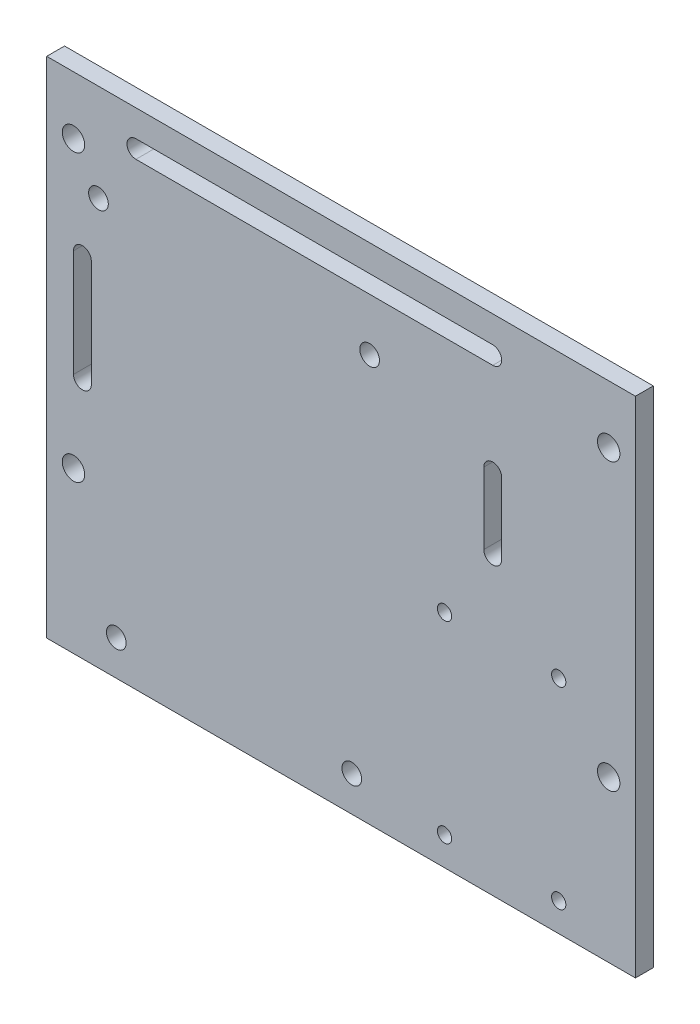
ISO-10303-21;
HEADER;
FILE_DESCRIPTION(('STEP AP214'),'2;1');
FILE_NAME('part.step','',(''),(''),'','','');
FILE_SCHEMA(('AUTOMOTIVE_DESIGN { 1 0 10303 214 1 1 1 1 }'));
ENDSEC;
DATA;
#1=APPLICATION_CONTEXT('core data for automotive mechanical design processes');
#2=APPLICATION_PROTOCOL_DEFINITION('international standard','automotive_design',2000,#1);
#3=PRODUCT_CONTEXT('',#1,'mechanical');
#4=PRODUCT('Part','Part','',(#3));
#5=PRODUCT_RELATED_PRODUCT_CATEGORY('part','',(#4));
#6=PRODUCT_DEFINITION_FORMATION('','',#4);
#7=PRODUCT_DEFINITION_CONTEXT('part definition',#1,'design');
#8=PRODUCT_DEFINITION('design','',#6,#7);
#9=PRODUCT_DEFINITION_SHAPE('','',#8);
#10=(LENGTH_UNIT() NAMED_UNIT(*) SI_UNIT(.MILLI.,.METRE.));
#11=(NAMED_UNIT(*) PLANE_ANGLE_UNIT() SI_UNIT($,.RADIAN.));
#12=(NAMED_UNIT(*) SI_UNIT($,.STERADIAN.) SOLID_ANGLE_UNIT());
#13=UNCERTAINTY_MEASURE_WITH_UNIT(LENGTH_MEASURE(1.E-05),#10,'distance_accuracy_value','');
#14=(GEOMETRIC_REPRESENTATION_CONTEXT(3) GLOBAL_UNCERTAINTY_ASSIGNED_CONTEXT((#13)) GLOBAL_UNIT_ASSIGNED_CONTEXT((#10,
#11,#12)) REPRESENTATION_CONTEXT('',''));
#15=CARTESIAN_POINT('',(0.,0.,0.));
#16=DIRECTION('',(0.,0.,1.));
#17=DIRECTION('',(1.,0.,0.));
#18=AXIS2_PLACEMENT_3D('',#15,#16,#17);
#19=CARTESIAN_POINT('',(52.3875,57.15,3.175));
#20=DIRECTION('',(-1.,0.,0.));
#21=DIRECTION('',(0.,-1.,0.));
#22=AXIS2_PLACEMENT_3D('',#19,#20,#21);
#23=PLANE('',#22);
#24=DIRECTION('',(0.,1.,0.));
#25=VECTOR('',#24,1.);
#26=CARTESIAN_POINT('',(52.3875,57.15,0.));
#27=LINE('',#26,#25);
#28=CARTESIAN_POINT('',(52.3875,-57.15,0.));
#29=VERTEX_POINT('',#28);
#30=CARTESIAN_POINT('',(52.3875,32.5188832375964,0.));
#31=VERTEX_POINT('',#30);
#32=EDGE_CURVE('E327',#29,#31,#27,.T.);
#33=ORIENTED_EDGE('',*,*,#32,.T.);
#34=DIRECTION('',(0.,0.,1.));
#35=VECTOR('',#34,1.);
#36=CARTESIAN_POINT('',(52.3875,32.5188832375964,-11.825));
#37=LINE('',#36,#35);
#38=CARTESIAN_POINT('',(52.3875,32.5188832375964,3.175));
#39=VERTEX_POINT('',#38);
#40=EDGE_CURVE('E253',#31,#39,#37,.T.);
#41=ORIENTED_EDGE('',*,*,#40,.T.);
#42=DIRECTION('',(0.,1.,0.));
#43=VECTOR('',#42,1.);
#44=CARTESIAN_POINT('',(52.3875,57.15,3.175));
#45=LINE('',#44,#43);
#46=CARTESIAN_POINT('',(52.3875,-57.15,3.175));
#47=VERTEX_POINT('',#46);
#48=EDGE_CURVE('E330',#47,#39,#45,.T.);
#49=ORIENTED_EDGE('',*,*,#48,.F.);
#50=DIRECTION('',(0.,0.,-1.));
#51=VECTOR('',#50,1.);
#52=CARTESIAN_POINT('',(52.3875,-57.15,3.175));
#53=LINE('',#52,#51);
#54=EDGE_CURVE('E338',#47,#29,#53,.T.);
#55=ORIENTED_EDGE('',*,*,#54,.T.);
#56=EDGE_LOOP('',(#33,#41,#49,#55));
#57=FACE_BOUND('',#56,.T.);
#58=ADVANCED_FACE('F37',(#57),#23,.F.);
#59=CARTESIAN_POINT('',(-52.3875,57.15,3.175));
#60=DIRECTION('',(1.,0.,0.));
#61=DIRECTION('',(0.,1.,0.));
#62=AXIS2_PLACEMENT_3D('',#59,#60,#61);
#63=PLANE('',#62);
#64=DIRECTION('',(0.,-1.,0.));
#65=VECTOR('',#64,1.);
#66=CARTESIAN_POINT('',(-52.3875,57.15,3.175));
#67=LINE('',#66,#65);
#68=CARTESIAN_POINT('',(-52.3875,32.5188832375964,3.175));
#69=VERTEX_POINT('',#68);
#70=CARTESIAN_POINT('',(-52.3875,-57.15,3.175));
#71=VERTEX_POINT('',#70);
#72=EDGE_CURVE('E333',#69,#71,#67,.T.);
#73=ORIENTED_EDGE('',*,*,#72,.F.);
#74=DIRECTION('',(0.,0.,1.));
#75=VECTOR('',#74,1.);
#76=CARTESIAN_POINT('',(-52.3875,32.5188832375964,-11.825));
#77=LINE('',#76,#75);
#78=CARTESIAN_POINT('',(-52.3875,32.5188832375964,0.));
#79=VERTEX_POINT('',#78);
#80=EDGE_CURVE('E252',#79,#69,#77,.T.);
#81=ORIENTED_EDGE('',*,*,#80,.F.);
#82=DIRECTION('',(0.,-1.,0.));
#83=VECTOR('',#82,1.);
#84=CARTESIAN_POINT('',(-52.3875,57.15,0.));
#85=LINE('',#84,#83);
#86=CARTESIAN_POINT('',(-52.3875,-57.15,0.));
#87=VERTEX_POINT('',#86);
#88=EDGE_CURVE('E341',#79,#87,#85,.T.);
#89=ORIENTED_EDGE('',*,*,#88,.T.);
#90=DIRECTION('',(0.,0.,-1.));
#91=VECTOR('',#90,1.);
#92=CARTESIAN_POINT('',(-52.3875,-57.15,3.175));
#93=LINE('',#92,#91);
#94=EDGE_CURVE('E44',#71,#87,#93,.T.);
#95=ORIENTED_EDGE('',*,*,#94,.F.);
#96=EDGE_LOOP('',(#73,#81,#89,#95));
#97=FACE_BOUND('',#96,.T.);
#98=ADVANCED_FACE('F364',(#97),#63,.F.);
#99=CARTESIAN_POINT('',(-52.3875,-57.15,3.175));
#100=DIRECTION('',(0.,1.,0.));
#101=DIRECTION('',(0.,0.,1.));
#102=AXIS2_PLACEMENT_3D('',#99,#100,#101);
#103=PLANE('',#102);
#104=DIRECTION('',(1.,0.,0.));
#105=VECTOR('',#104,1.);
#106=CARTESIAN_POINT('',(-52.3875,-57.15,0.));
#107=LINE('',#106,#105);
#108=EDGE_CURVE('E334',#87,#29,#107,.T.);
#109=ORIENTED_EDGE('',*,*,#108,.T.);
#110=ORIENTED_EDGE('',*,*,#54,.F.);
#111=DIRECTION('',(1.,0.,0.));
#112=VECTOR('',#111,1.);
#113=CARTESIAN_POINT('',(-52.3875,-57.15,3.175));
#114=LINE('',#113,#112);
#115=EDGE_CURVE('E336',#71,#47,#114,.T.);
#116=ORIENTED_EDGE('',*,*,#115,.F.);
#117=ORIENTED_EDGE('',*,*,#94,.T.);
#118=EDGE_LOOP('',(#109,#110,#116,#117));
#119=FACE_BOUND('',#118,.T.);
#120=ADVANCED_FACE('F350',(#119),#103,.F.);
#121=CARTESIAN_POINT('',(0.,0.,3.175));
#122=DIRECTION('',(0.,0.,1.));
#123=DIRECTION('',(1.,0.,0.));
#124=AXIS2_PLACEMENT_3D('',#121,#122,#123);
#125=PLANE('',#124);
#126=CARTESIAN_POINT('',(-46.0375,4.92426118023712,3.175));
#127=DIRECTION('',(0.,0.,1.));
#128=DIRECTION('',(1.,0.,0.));
#129=AXIS2_PLACEMENT_3D('',#126,#127,#128);
#130=CIRCLE('',#129,1.5875);
#131=CARTESIAN_POINT('',(-44.45,4.92426118023711,3.175));
#132=VERTEX_POINT('',#131);
#133=CARTESIAN_POINT('',(-47.625,4.92426118023711,3.175));
#134=VERTEX_POINT('',#133);
#135=EDGE_CURVE('E51',#132,#134,#130,.T.);
#136=ORIENTED_EDGE('',*,*,#135,.F.);
#137=DIRECTION('',(0.,1.,0.));
#138=VECTOR('',#137,1.);
#139=CARTESIAN_POINT('',(-44.45,4.92426118023711,3.175));
#140=LINE('',#139,#138);
#141=CARTESIAN_POINT('',(-44.45,-14.1257388197629,3.175));
#142=VERTEX_POINT('',#141);
#143=EDGE_CURVE('E170',#142,#132,#140,.T.);
#144=ORIENTED_EDGE('',*,*,#143,.F.);
#145=CARTESIAN_POINT('',(-46.0375,-14.1257388197629,3.175));
#146=DIRECTION('',(0.,0.,1.));
#147=DIRECTION('',(1.,0.,0.));
#148=AXIS2_PLACEMENT_3D('',#145,#146,#147);
#149=CIRCLE('',#148,1.5875);
#150=CARTESIAN_POINT('',(-47.625,-14.1257388197629,3.175));
#151=VERTEX_POINT('',#150);
#152=EDGE_CURVE('E173',#151,#142,#149,.T.);
#153=ORIENTED_EDGE('',*,*,#152,.F.);
#154=DIRECTION('',(0.,-1.,0.));
#155=VECTOR('',#154,1.);
#156=CARTESIAN_POINT('',(-47.625,4.92426118023711,3.175));
#157=LINE('',#156,#155);
#158=EDGE_CURVE('E179',#134,#151,#157,.T.);
#159=ORIENTED_EDGE('',*,*,#158,.F.);
#160=EDGE_LOOP('',(#136,#144,#153,#159));
#161=FACE_BOUND('',#160,.T.);
#162=CARTESIAN_POINT('',(-36.5125,26.1688832375964,3.175));
#163=DIRECTION('',(0.,0.,1.));
#164=DIRECTION('',(1.,0.,0.));
#165=AXIS2_PLACEMENT_3D('',#162,#163,#164);
#166=CIRCLE('',#165,1.5875);
#167=CARTESIAN_POINT('',(-36.5125,27.7563832375964,3.175));
#168=VERTEX_POINT('',#167);
#169=CARTESIAN_POINT('',(-36.5125,24.5813832375964,3.175));
#170=VERTEX_POINT('',#169);
#171=EDGE_CURVE('E59',#168,#170,#166,.T.);
#172=ORIENTED_EDGE('',*,*,#171,.F.);
#173=DIRECTION('',(-1.,0.,0.));
#174=VECTOR('',#173,1.);
#175=CARTESIAN_POINT('',(-36.5125,27.7563832375964,3.175));
#176=LINE('',#175,#174);
#177=CARTESIAN_POINT('',(26.9875,27.7563832375964,3.175));
#178=VERTEX_POINT('',#177);
#179=EDGE_CURVE('E194',#178,#168,#176,.T.);
#180=ORIENTED_EDGE('',*,*,#179,.F.);
#181=CARTESIAN_POINT('',(26.9875,26.1688832375964,3.175));
#182=DIRECTION('',(0.,0.,1.));
#183=DIRECTION('',(1.,0.,0.));
#184=AXIS2_PLACEMENT_3D('',#181,#182,#183);
#185=CIRCLE('',#184,1.5875);
#186=CARTESIAN_POINT('',(26.9875,24.5813832375964,3.175));
#187=VERTEX_POINT('',#186);
#188=EDGE_CURVE('E209',#187,#178,#185,.T.);
#189=ORIENTED_EDGE('',*,*,#188,.F.);
#190=DIRECTION('',(1.,0.,0.));
#191=VECTOR('',#190,1.);
#192=CARTESIAN_POINT('',(-36.5125,24.5813832375964,3.175));
#193=LINE('',#192,#191);
#194=EDGE_CURVE('E205',#170,#187,#193,.T.);
#195=ORIENTED_EDGE('',*,*,#194,.F.);
#196=EDGE_LOOP('',(#172,#180,#189,#195));
#197=FACE_BOUND('',#196,.T.);
#198=CARTESIAN_POINT('',(26.9875,8.09926118023711,3.175));
#199=DIRECTION('',(0.,0.,1.));
#200=DIRECTION('',(1.,0.,0.));
#201=AXIS2_PLACEMENT_3D('',#198,#199,#200);
#202=CIRCLE('',#201,1.58750000000001);
#203=CARTESIAN_POINT('',(28.575,8.09926118023711,3.175));
#204=VERTEX_POINT('',#203);
#205=CARTESIAN_POINT('',(25.4,8.09926118023711,3.175));
#206=VERTEX_POINT('',#205);
#207=EDGE_CURVE('E234',#204,#206,#202,.T.);
#208=ORIENTED_EDGE('',*,*,#207,.F.);
#209=DIRECTION('',(0.,1.,0.));
#210=VECTOR('',#209,1.);
#211=CARTESIAN_POINT('',(28.575,8.09926118023711,3.175));
#212=LINE('',#211,#210);
#213=CARTESIAN_POINT('',(28.575,-4.60073881976289,3.175));
#214=VERTEX_POINT('',#213);
#215=EDGE_CURVE('E224',#214,#204,#212,.T.);
#216=ORIENTED_EDGE('',*,*,#215,.F.);
#217=CARTESIAN_POINT('',(26.9875,-4.60073881976289,3.175));
#218=DIRECTION('',(0.,0.,1.));
#219=DIRECTION('',(1.,0.,0.));
#220=AXIS2_PLACEMENT_3D('',#217,#218,#219);
#221=CIRCLE('',#220,1.5875);
#222=CARTESIAN_POINT('',(25.4,-4.60073881976289,3.175));
#223=VERTEX_POINT('',#222);
#224=EDGE_CURVE('E239',#223,#214,#221,.T.);
#225=ORIENTED_EDGE('',*,*,#224,.F.);
#226=DIRECTION('',(0.,-1.,0.));
#227=VECTOR('',#226,1.);
#228=CARTESIAN_POINT('',(25.4,8.09926118023711,3.175));
#229=LINE('',#228,#227);
#230=EDGE_CURVE('E236',#206,#223,#229,.T.);
#231=ORIENTED_EDGE('',*,*,#230,.F.);
#232=EDGE_LOOP('',(#208,#216,#225,#231));
#233=FACE_BOUND('',#232,.T.);
#234=DIRECTION('',(1.,0.,0.));
#235=VECTOR('',#234,1.);
#236=CARTESIAN_POINT('',(-52.3875,32.5188832375964,3.175));
#237=LINE('',#236,#235);
#238=EDGE_CURVE('E186',#69,#39,#237,.T.);
#239=ORIENTED_EDGE('',*,*,#238,.F.);
#240=ORIENTED_EDGE('',*,*,#72,.T.);
#241=ORIENTED_EDGE('',*,*,#115,.T.);
#242=ORIENTED_EDGE('',*,*,#48,.T.);
#243=EDGE_LOOP('',(#239,#240,#241,#242));
#244=FACE_BOUND('',#243,.T.);
#245=CARTESIAN_POINT('',(38.735,-52.07,3.175));
#246=DIRECTION('',(0.,0.,1.));
#247=DIRECTION('',(1.,0.,0.));
#248=AXIS2_PLACEMENT_3D('',#245,#246,#247);
#249=CIRCLE('',#248,1.27);
#250=CARTESIAN_POINT('',(40.005,-52.07,3.175));
#251=VERTEX_POINT('',#250);
#252=EDGE_CURVE('E268',#251,#251,#249,.T.);
#253=ORIENTED_EDGE('',*,*,#252,.F.);
#254=EDGE_LOOP('',(#253));
#255=FACE_BOUND('',#254,.T.);
#256=CARTESIAN_POINT('',(18.415,-17.78,3.175));
#257=DIRECTION('',(0.,0.,1.));
#258=DIRECTION('',(1.,0.,0.));
#259=AXIS2_PLACEMENT_3D('',#256,#257,#258);
#260=CIRCLE('',#259,1.27);
#261=CARTESIAN_POINT('',(19.685,-17.78,3.175));
#262=VERTEX_POINT('',#261);
#263=EDGE_CURVE('E261',#262,#262,#260,.T.);
#264=ORIENTED_EDGE('',*,*,#263,.F.);
#265=EDGE_LOOP('',(#264));
#266=FACE_BOUND('',#265,.T.);
#267=CARTESIAN_POINT('',(18.415,-52.07,3.175));
#268=DIRECTION('',(0.,0.,1.));
#269=DIRECTION('',(1.,0.,0.));
#270=AXIS2_PLACEMENT_3D('',#267,#268,#269);
#271=CIRCLE('',#270,1.27000000000001);
#272=CARTESIAN_POINT('',(19.685,-52.07,3.175));
#273=VERTEX_POINT('',#272);
#274=EDGE_CURVE('E256',#273,#273,#271,.T.);
#275=ORIENTED_EDGE('',*,*,#274,.F.);
#276=EDGE_LOOP('',(#275));
#277=FACE_BOUND('',#276,.T.);
#278=CARTESIAN_POINT('',(38.735,-17.78,3.175));
#279=DIRECTION('',(0.,0.,1.));
#280=DIRECTION('',(1.,0.,0.));
#281=AXIS2_PLACEMENT_3D('',#278,#279,#280);
#282=CIRCLE('',#281,1.27);
#283=CARTESIAN_POINT('',(40.005,-17.78,3.175));
#284=VERTEX_POINT('',#283);
#285=EDGE_CURVE('E267',#284,#284,#282,.T.);
#286=ORIENTED_EDGE('',*,*,#285,.F.);
#287=EDGE_LOOP('',(#286));
#288=FACE_BOUND('',#287,.T.);
#289=CARTESIAN_POINT('',(-47.625,-28.575,3.175));
#290=DIRECTION('',(0.,0.,1.));
#291=DIRECTION('',(1.,0.,0.));
#292=AXIS2_PLACEMENT_3D('',#289,#290,#291);
#293=CIRCLE('',#292,2.);
#294=CARTESIAN_POINT('',(-45.625,-28.575,3.175));
#295=VERTEX_POINT('',#294);
#296=EDGE_CURVE('E279',#295,#295,#293,.T.);
#297=ORIENTED_EDGE('',*,*,#296,.F.);
#298=EDGE_LOOP('',(#297));
#299=FACE_BOUND('',#298,.T.);
#300=CARTESIAN_POINT('',(47.625,-28.575,3.175));
#301=DIRECTION('',(0.,0.,1.));
#302=DIRECTION('',(1.,0.,0.));
#303=AXIS2_PLACEMENT_3D('',#300,#301,#302);
#304=CIRCLE('',#303,2.00000000000001);
#305=CARTESIAN_POINT('',(49.625,-28.575,3.175));
#306=VERTEX_POINT('',#305);
#307=EDGE_CURVE('E292',#306,#306,#304,.T.);
#308=ORIENTED_EDGE('',*,*,#307,.F.);
#309=EDGE_LOOP('',(#308));
#310=FACE_BOUND('',#309,.T.);
#311=CARTESIAN_POINT('',(47.625,22.225,3.175));
#312=DIRECTION('',(0.,0.,1.));
#313=DIRECTION('',(1.,0.,0.));
#314=AXIS2_PLACEMENT_3D('',#311,#312,#313);
#315=CIRCLE('',#314,2.00000000000001);
#316=CARTESIAN_POINT('',(49.625,22.225,3.175));
#317=VERTEX_POINT('',#316);
#318=EDGE_CURVE('E286',#317,#317,#315,.T.);
#319=ORIENTED_EDGE('',*,*,#318,.F.);
#320=EDGE_LOOP('',(#319));
#321=FACE_BOUND('',#320,.T.);
#322=CARTESIAN_POINT('',(-47.625,22.225,3.175));
#323=DIRECTION('',(0.,0.,1.));
#324=DIRECTION('',(1.,0.,0.));
#325=AXIS2_PLACEMENT_3D('',#322,#323,#324);
#326=CIRCLE('',#325,2.00000000000001);
#327=CARTESIAN_POINT('',(-45.625,22.225,3.175));
#328=VERTEX_POINT('',#327);
#329=EDGE_CURVE('E285',#328,#328,#326,.T.);
#330=ORIENTED_EDGE('',*,*,#329,.F.);
#331=EDGE_LOOP('',(#330));
#332=FACE_BOUND('',#331,.T.);
#333=CARTESIAN_POINT('',(5.07999999999999,15.24,3.175));
#334=DIRECTION('',(0.,0.,1.));
#335=DIRECTION('',(1.,0.,0.));
#336=AXIS2_PLACEMENT_3D('',#333,#334,#335);
#337=CIRCLE('',#336,1.7526);
#338=CARTESIAN_POINT('',(6.83259999999999,15.24,3.175));
#339=VERTEX_POINT('',#338);
#340=EDGE_CURVE('E316',#339,#339,#337,.T.);
#341=ORIENTED_EDGE('',*,*,#340,.F.);
#342=EDGE_LOOP('',(#341));
#343=FACE_BOUND('',#342,.T.);
#344=CARTESIAN_POINT('',(-40.005,-50.8762,3.175));
#345=DIRECTION('',(0.,0.,1.));
#346=DIRECTION('',(1.,0.,0.));
#347=AXIS2_PLACEMENT_3D('',#344,#345,#346);
#348=CIRCLE('',#347,1.7526);
#349=CARTESIAN_POINT('',(-38.2524,-50.8762,3.175));
#350=VERTEX_POINT('',#349);
#351=EDGE_CURVE('E309',#350,#350,#348,.T.);
#352=ORIENTED_EDGE('',*,*,#351,.F.);
#353=EDGE_LOOP('',(#352));
#354=FACE_BOUND('',#353,.T.);
#355=CARTESIAN_POINT('',(1.905,-50.8762,3.175));
#356=DIRECTION('',(0.,0.,1.));
#357=DIRECTION('',(1.,0.,0.));
#358=AXIS2_PLACEMENT_3D('',#355,#356,#357);
#359=CIRCLE('',#358,1.75260000000001);
#360=CARTESIAN_POINT('',(3.6576,-50.8762,3.175));
#361=VERTEX_POINT('',#360);
#362=EDGE_CURVE('E303',#361,#361,#359,.T.);
#363=ORIENTED_EDGE('',*,*,#362,.F.);
#364=EDGE_LOOP('',(#363));
#365=FACE_BOUND('',#364,.T.);
#366=CARTESIAN_POINT('',(-43.18,15.24,3.175));
#367=DIRECTION('',(0.,0.,1.));
#368=DIRECTION('',(1.,0.,0.));
#369=AXIS2_PLACEMENT_3D('',#366,#367,#368);
#370=CIRCLE('',#369,1.7526);
#371=CARTESIAN_POINT('',(-41.4274,15.24,3.175));
#372=VERTEX_POINT('',#371);
#373=EDGE_CURVE('E315',#372,#372,#370,.T.);
#374=ORIENTED_EDGE('',*,*,#373,.F.);
#375=EDGE_LOOP('',(#374));
#376=FACE_BOUND('',#375,.T.);
#377=ADVANCED_FACE('F361',(#161,#197,#233,#244,#255,#266,#277,#288,#299,#310,#321,#332,#343,
#354,#365,#376),#125,.T.);
#378=CARTESIAN_POINT('',(0.,0.,0.));
#379=DIRECTION('',(0.,0.,1.));
#380=DIRECTION('',(1.,0.,0.));
#381=AXIS2_PLACEMENT_3D('',#378,#379,#380);
#382=PLANE('',#381);
#383=DIRECTION('',(0.,1.,0.));
#384=VECTOR('',#383,1.);
#385=CARTESIAN_POINT('',(-44.45,4.92426118023711,0.));
#386=LINE('',#385,#384);
#387=CARTESIAN_POINT('',(-44.45,-14.1257388197629,0.));
#388=VERTEX_POINT('',#387);
#389=CARTESIAN_POINT('',(-44.45,4.92426118023711,0.));
#390=VERTEX_POINT('',#389);
#391=EDGE_CURVE('E157',#388,#390,#386,.T.);
#392=ORIENTED_EDGE('',*,*,#391,.T.);
#393=CARTESIAN_POINT('',(-46.0375,4.92426118023712,0.));
#394=DIRECTION('',(0.,0.,1.));
#395=DIRECTION('',(1.,0.,0.));
#396=AXIS2_PLACEMENT_3D('',#393,#394,#395);
#397=CIRCLE('',#396,1.5875);
#398=CARTESIAN_POINT('',(-47.625,4.92426118023711,0.));
#399=VERTEX_POINT('',#398);
#400=EDGE_CURVE('E151',#390,#399,#397,.T.);
#401=ORIENTED_EDGE('',*,*,#400,.T.);
#402=DIRECTION('',(0.,-1.,0.));
#403=VECTOR('',#402,1.);
#404=CARTESIAN_POINT('',(-47.625,4.92426118023711,0.));
#405=LINE('',#404,#403);
#406=CARTESIAN_POINT('',(-47.625,-14.1257388197629,0.));
#407=VERTEX_POINT('',#406);
#408=EDGE_CURVE('E161',#399,#407,#405,.T.);
#409=ORIENTED_EDGE('',*,*,#408,.T.);
#410=CARTESIAN_POINT('',(-46.0375,-14.1257388197629,0.));
#411=DIRECTION('',(0.,0.,1.));
#412=DIRECTION('',(1.,0.,0.));
#413=AXIS2_PLACEMENT_3D('',#410,#411,#412);
#414=CIRCLE('',#413,1.5875);
#415=EDGE_CURVE('E165',#407,#388,#414,.T.);
#416=ORIENTED_EDGE('',*,*,#415,.T.);
#417=EDGE_LOOP('',(#392,#401,#409,#416));
#418=FACE_BOUND('',#417,.T.);
#419=DIRECTION('',(-1.,0.,0.));
#420=VECTOR('',#419,1.);
#421=CARTESIAN_POINT('',(-36.5125,27.7563832375964,0.));
#422=LINE('',#421,#420);
#423=CARTESIAN_POINT('',(26.9875,27.7563832375964,0.));
#424=VERTEX_POINT('',#423);
#425=CARTESIAN_POINT('',(-36.5125,27.7563832375964,0.));
#426=VERTEX_POINT('',#425);
#427=EDGE_CURVE('E200',#424,#426,#422,.T.);
#428=ORIENTED_EDGE('',*,*,#427,.T.);
#429=CARTESIAN_POINT('',(-36.5125,26.1688832375964,0.));
#430=DIRECTION('',(0.,0.,1.));
#431=DIRECTION('',(1.,0.,0.));
#432=AXIS2_PLACEMENT_3D('',#429,#430,#431);
#433=CIRCLE('',#432,1.5875);
#434=CARTESIAN_POINT('',(-36.5125,24.5813832375964,0.));
#435=VERTEX_POINT('',#434);
#436=EDGE_CURVE('E190',#426,#435,#433,.T.);
#437=ORIENTED_EDGE('',*,*,#436,.T.);
#438=DIRECTION('',(1.,0.,0.));
#439=VECTOR('',#438,1.);
#440=CARTESIAN_POINT('',(-36.5125,24.5813832375964,0.));
#441=LINE('',#440,#439);
#442=CARTESIAN_POINT('',(26.9875,24.5813832375964,0.));
#443=VERTEX_POINT('',#442);
#444=EDGE_CURVE('E193',#435,#443,#441,.T.);
#445=ORIENTED_EDGE('',*,*,#444,.T.);
#446=CARTESIAN_POINT('',(26.9875,26.1688832375964,0.));
#447=DIRECTION('',(0.,0.,1.));
#448=DIRECTION('',(1.,0.,0.));
#449=AXIS2_PLACEMENT_3D('',#446,#447,#448);
#450=CIRCLE('',#449,1.5875);
#451=EDGE_CURVE('E197',#443,#424,#450,.T.);
#452=ORIENTED_EDGE('',*,*,#451,.T.);
#453=EDGE_LOOP('',(#428,#437,#445,#452));
#454=FACE_BOUND('',#453,.T.);
#455=DIRECTION('',(0.,1.,0.));
#456=VECTOR('',#455,1.);
#457=CARTESIAN_POINT('',(28.575,8.09926118023711,0.));
#458=LINE('',#457,#456);
#459=CARTESIAN_POINT('',(28.575,-4.60073881976289,0.));
#460=VERTEX_POINT('',#459);
#461=CARTESIAN_POINT('',(28.575,8.09926118023711,0.));
#462=VERTEX_POINT('',#461);
#463=EDGE_CURVE('E230',#460,#462,#458,.T.);
#464=ORIENTED_EDGE('',*,*,#463,.T.);
#465=CARTESIAN_POINT('',(26.9875,8.09926118023711,0.));
#466=DIRECTION('',(0.,0.,1.));
#467=DIRECTION('',(1.,0.,0.));
#468=AXIS2_PLACEMENT_3D('',#465,#466,#467);
#469=CIRCLE('',#468,1.58750000000001);
#470=CARTESIAN_POINT('',(25.4,8.09926118023711,0.));
#471=VERTEX_POINT('',#470);
#472=EDGE_CURVE('E220',#462,#471,#469,.T.);
#473=ORIENTED_EDGE('',*,*,#472,.T.);
#474=DIRECTION('',(0.,-1.,0.));
#475=VECTOR('',#474,1.);
#476=CARTESIAN_POINT('',(25.4,8.09926118023711,0.));
#477=LINE('',#476,#475);
#478=CARTESIAN_POINT('',(25.4,-4.60073881976289,0.));
#479=VERTEX_POINT('',#478);
#480=EDGE_CURVE('E223',#471,#479,#477,.T.);
#481=ORIENTED_EDGE('',*,*,#480,.T.);
#482=CARTESIAN_POINT('',(26.9875,-4.60073881976289,0.));
#483=DIRECTION('',(0.,0.,1.));
#484=DIRECTION('',(1.,0.,0.));
#485=AXIS2_PLACEMENT_3D('',#482,#483,#484);
#486=CIRCLE('',#485,1.5875);
#487=EDGE_CURVE('E227',#479,#460,#486,.T.);
#488=ORIENTED_EDGE('',*,*,#487,.T.);
#489=EDGE_LOOP('',(#464,#473,#481,#488));
#490=FACE_BOUND('',#489,.T.);
#491=CARTESIAN_POINT('',(38.735,-52.07,0.));
#492=DIRECTION('',(0.,0.,1.));
#493=DIRECTION('',(1.,0.,0.));
#494=AXIS2_PLACEMENT_3D('',#491,#492,#493);
#495=CIRCLE('',#494,1.27);
#496=CARTESIAN_POINT('',(40.005,-52.07,0.));
#497=VERTEX_POINT('',#496);
#498=EDGE_CURVE('E264',#497,#497,#495,.T.);
#499=ORIENTED_EDGE('',*,*,#498,.T.);
#500=EDGE_LOOP('',(#499));
#501=FACE_BOUND('',#500,.T.);
#502=CARTESIAN_POINT('',(18.415,-17.78,0.));
#503=DIRECTION('',(0.,0.,1.));
#504=DIRECTION('',(1.,0.,0.));
#505=AXIS2_PLACEMENT_3D('',#502,#503,#504);
#506=CIRCLE('',#505,1.27);
#507=CARTESIAN_POINT('',(19.685,-17.78,0.));
#508=VERTEX_POINT('',#507);
#509=EDGE_CURVE('E271',#508,#508,#506,.T.);
#510=ORIENTED_EDGE('',*,*,#509,.T.);
#511=EDGE_LOOP('',(#510));
#512=FACE_BOUND('',#511,.T.);
#513=CARTESIAN_POINT('',(18.415,-52.07,0.));
#514=DIRECTION('',(0.,0.,1.));
#515=DIRECTION('',(1.,0.,0.));
#516=AXIS2_PLACEMENT_3D('',#513,#514,#515);
#517=CIRCLE('',#516,1.27000000000001);
#518=CARTESIAN_POINT('',(19.685,-52.07,0.));
#519=VERTEX_POINT('',#518);
#520=EDGE_CURVE('E258',#519,#519,#517,.T.);
#521=ORIENTED_EDGE('',*,*,#520,.T.);
#522=EDGE_LOOP('',(#521));
#523=FACE_BOUND('',#522,.T.);
#524=CARTESIAN_POINT('',(38.735,-17.78,0.));
#525=DIRECTION('',(0.,0.,1.));
#526=DIRECTION('',(1.,0.,0.));
#527=AXIS2_PLACEMENT_3D('',#524,#525,#526);
#528=CIRCLE('',#527,1.27);
#529=CARTESIAN_POINT('',(40.005,-17.78,0.));
#530=VERTEX_POINT('',#529);
#531=EDGE_CURVE('E276',#530,#530,#528,.T.);
#532=ORIENTED_EDGE('',*,*,#531,.T.);
#533=EDGE_LOOP('',(#532));
#534=FACE_BOUND('',#533,.T.);
#535=CARTESIAN_POINT('',(-47.625,-28.575,0.));
#536=DIRECTION('',(0.,0.,1.));
#537=DIRECTION('',(1.,0.,0.));
#538=AXIS2_PLACEMENT_3D('',#535,#536,#537);
#539=CIRCLE('',#538,2.);
#540=CARTESIAN_POINT('',(-45.625,-28.575,0.));
#541=VERTEX_POINT('',#540);
#542=EDGE_CURVE('E295',#541,#541,#539,.T.);
#543=ORIENTED_EDGE('',*,*,#542,.T.);
#544=EDGE_LOOP('',(#543));
#545=FACE_BOUND('',#544,.T.);
#546=CARTESIAN_POINT('',(47.625,-28.575,0.));
#547=DIRECTION('',(0.,0.,1.));
#548=DIRECTION('',(1.,0.,0.));
#549=AXIS2_PLACEMENT_3D('',#546,#547,#548);
#550=CIRCLE('',#549,2.00000000000001);
#551=CARTESIAN_POINT('',(49.625,-28.575,0.));
#552=VERTEX_POINT('',#551);
#553=EDGE_CURVE('E289',#552,#552,#550,.T.);
#554=ORIENTED_EDGE('',*,*,#553,.T.);
#555=EDGE_LOOP('',(#554));
#556=FACE_BOUND('',#555,.T.);
#557=CARTESIAN_POINT('',(47.625,22.225,0.));
#558=DIRECTION('',(0.,0.,1.));
#559=DIRECTION('',(1.,0.,0.));
#560=AXIS2_PLACEMENT_3D('',#557,#558,#559);
#561=CIRCLE('',#560,2.00000000000001);
#562=CARTESIAN_POINT('',(49.625,22.225,0.));
#563=VERTEX_POINT('',#562);
#564=EDGE_CURVE('E282',#563,#563,#561,.T.);
#565=ORIENTED_EDGE('',*,*,#564,.T.);
#566=EDGE_LOOP('',(#565));
#567=FACE_BOUND('',#566,.T.);
#568=CARTESIAN_POINT('',(-47.625,22.225,0.));
#569=DIRECTION('',(0.,0.,1.));
#570=DIRECTION('',(1.,0.,0.));
#571=AXIS2_PLACEMENT_3D('',#568,#569,#570);
#572=CIRCLE('',#571,2.00000000000001);
#573=CARTESIAN_POINT('',(-45.625,22.225,0.));
#574=VERTEX_POINT('',#573);
#575=EDGE_CURVE('E300',#574,#574,#572,.T.);
#576=ORIENTED_EDGE('',*,*,#575,.T.);
#577=EDGE_LOOP('',(#576));
#578=FACE_BOUND('',#577,.T.);
#579=CARTESIAN_POINT('',(5.07999999999999,15.24,0.));
#580=DIRECTION('',(0.,0.,1.));
#581=DIRECTION('',(1.,0.,0.));
#582=AXIS2_PLACEMENT_3D('',#579,#580,#581);
#583=CIRCLE('',#582,1.7526);
#584=CARTESIAN_POINT('',(6.83259999999999,15.24,0.));
#585=VERTEX_POINT('',#584);
#586=EDGE_CURVE('E312',#585,#585,#583,.T.);
#587=ORIENTED_EDGE('',*,*,#586,.T.);
#588=EDGE_LOOP('',(#587));
#589=FACE_BOUND('',#588,.T.);
#590=CARTESIAN_POINT('',(-40.005,-50.8762,0.));
#591=DIRECTION('',(0.,0.,1.));
#592=DIRECTION('',(1.,0.,0.));
#593=AXIS2_PLACEMENT_3D('',#590,#591,#592);
#594=CIRCLE('',#593,1.7526);
#595=CARTESIAN_POINT('',(-38.2524,-50.8762,0.));
#596=VERTEX_POINT('',#595);
#597=EDGE_CURVE('E319',#596,#596,#594,.T.);
#598=ORIENTED_EDGE('',*,*,#597,.T.);
#599=EDGE_LOOP('',(#598));
#600=FACE_BOUND('',#599,.T.);
#601=CARTESIAN_POINT('',(1.905,-50.8762,0.));
#602=DIRECTION('',(0.,0.,1.));
#603=DIRECTION('',(1.,0.,0.));
#604=AXIS2_PLACEMENT_3D('',#601,#602,#603);
#605=CIRCLE('',#604,1.75260000000001);
#606=CARTESIAN_POINT('',(3.6576,-50.8762,0.));
#607=VERTEX_POINT('',#606);
#608=EDGE_CURVE('E306',#607,#607,#605,.T.);
#609=ORIENTED_EDGE('',*,*,#608,.T.);
#610=EDGE_LOOP('',(#609));
#611=FACE_BOUND('',#610,.T.);
#612=CARTESIAN_POINT('',(-43.18,15.24,0.));
#613=DIRECTION('',(0.,0.,1.));
#614=DIRECTION('',(1.,0.,0.));
#615=AXIS2_PLACEMENT_3D('',#612,#613,#614);
#616=CIRCLE('',#615,1.7526);
#617=CARTESIAN_POINT('',(-41.4274,15.24,0.));
#618=VERTEX_POINT('',#617);
#619=EDGE_CURVE('E324',#618,#618,#616,.T.);
#620=ORIENTED_EDGE('',*,*,#619,.T.);
#621=EDGE_LOOP('',(#620));
#622=FACE_BOUND('',#621,.T.);
#623=ORIENTED_EDGE('',*,*,#88,.F.);
#624=DIRECTION('',(1.,0.,0.));
#625=VECTOR('',#624,1.);
#626=CARTESIAN_POINT('',(0.,32.5188832375964,0.));
#627=LINE('',#626,#625);
#628=EDGE_CURVE('E11',#79,#31,#627,.T.);
#629=ORIENTED_EDGE('',*,*,#628,.T.);
#630=ORIENTED_EDGE('',*,*,#32,.F.);
#631=ORIENTED_EDGE('',*,*,#108,.F.);
#632=EDGE_LOOP('',(#623,#629,#630,#631));
#633=FACE_BOUND('',#632,.T.);
#634=ADVANCED_FACE('F167',(#418,#454,#490,#501,#512,#523,#534,#545,#556,#567,#578,#589,#600,
#611,#622,#633),#382,.F.);
#635=CARTESIAN_POINT('',(-43.18,15.24,0.));
#636=DIRECTION('',(0.,0.,1.));
#637=DIRECTION('',(1.,0.,0.));
#638=AXIS2_PLACEMENT_3D('',#635,#636,#637);
#639=CYLINDRICAL_SURFACE('',#638,1.7526);
#640=ORIENTED_EDGE('',*,*,#619,.F.);
#641=EDGE_LOOP('',(#640));
#642=FACE_BOUND('',#641,.T.);
#643=ORIENTED_EDGE('',*,*,#373,.T.);
#644=EDGE_LOOP('',(#643));
#645=FACE_BOUND('',#644,.T.);
#646=ADVANCED_FACE('F393',(#642,#645),#639,.F.);
#647=CARTESIAN_POINT('',(1.905,-50.8762,0.));
#648=DIRECTION('',(0.,0.,1.));
#649=DIRECTION('',(1.,0.,0.));
#650=AXIS2_PLACEMENT_3D('',#647,#648,#649);
#651=CYLINDRICAL_SURFACE('',#650,1.75260000000001);
#652=ORIENTED_EDGE('',*,*,#608,.F.);
#653=EDGE_LOOP('',(#652));
#654=FACE_BOUND('',#653,.T.);
#655=ORIENTED_EDGE('',*,*,#362,.T.);
#656=EDGE_LOOP('',(#655));
#657=FACE_BOUND('',#656,.T.);
#658=ADVANCED_FACE('F399',(#654,#657),#651,.F.);
#659=CARTESIAN_POINT('',(-40.005,-50.8762,0.));
#660=DIRECTION('',(0.,0.,1.));
#661=DIRECTION('',(1.,0.,0.));
#662=AXIS2_PLACEMENT_3D('',#659,#660,#661);
#663=CYLINDRICAL_SURFACE('',#662,1.7526);
#664=ORIENTED_EDGE('',*,*,#597,.F.);
#665=EDGE_LOOP('',(#664));
#666=FACE_BOUND('',#665,.T.);
#667=ORIENTED_EDGE('',*,*,#351,.T.);
#668=EDGE_LOOP('',(#667));
#669=FACE_BOUND('',#668,.T.);
#670=ADVANCED_FACE('F401',(#666,#669),#663,.F.);
#671=CARTESIAN_POINT('',(5.07999999999999,15.24,0.));
#672=DIRECTION('',(0.,0.,1.));
#673=DIRECTION('',(1.,0.,0.));
#674=AXIS2_PLACEMENT_3D('',#671,#672,#673);
#675=CYLINDRICAL_SURFACE('',#674,1.7526);
#676=ORIENTED_EDGE('',*,*,#586,.F.);
#677=EDGE_LOOP('',(#676));
#678=FACE_BOUND('',#677,.T.);
#679=ORIENTED_EDGE('',*,*,#340,.T.);
#680=EDGE_LOOP('',(#679));
#681=FACE_BOUND('',#680,.T.);
#682=ADVANCED_FACE('F404',(#678,#681),#675,.F.);
#683=CARTESIAN_POINT('',(-47.625,22.225,0.));
#684=DIRECTION('',(0.,0.,1.));
#685=DIRECTION('',(1.,0.,0.));
#686=AXIS2_PLACEMENT_3D('',#683,#684,#685);
#687=CYLINDRICAL_SURFACE('',#686,2.00000000000001);
#688=ORIENTED_EDGE('',*,*,#575,.F.);
#689=EDGE_LOOP('',(#688));
#690=FACE_BOUND('',#689,.T.);
#691=ORIENTED_EDGE('',*,*,#329,.T.);
#692=EDGE_LOOP('',(#691));
#693=FACE_BOUND('',#692,.T.);
#694=ADVANCED_FACE('F408',(#690,#693),#687,.F.);
#695=CARTESIAN_POINT('',(47.625,22.225,0.));
#696=DIRECTION('',(0.,0.,1.));
#697=DIRECTION('',(1.,0.,0.));
#698=AXIS2_PLACEMENT_3D('',#695,#696,#697);
#699=CYLINDRICAL_SURFACE('',#698,2.00000000000001);
#700=ORIENTED_EDGE('',*,*,#564,.F.);
#701=EDGE_LOOP('',(#700));
#702=FACE_BOUND('',#701,.T.);
#703=ORIENTED_EDGE('',*,*,#318,.T.);
#704=EDGE_LOOP('',(#703));
#705=FACE_BOUND('',#704,.T.);
#706=ADVANCED_FACE('F415',(#702,#705),#699,.F.);
#707=CARTESIAN_POINT('',(47.625,-28.575,0.));
#708=DIRECTION('',(0.,0.,1.));
#709=DIRECTION('',(1.,0.,0.));
#710=AXIS2_PLACEMENT_3D('',#707,#708,#709);
#711=CYLINDRICAL_SURFACE('',#710,2.00000000000001);
#712=ORIENTED_EDGE('',*,*,#553,.F.);
#713=EDGE_LOOP('',(#712));
#714=FACE_BOUND('',#713,.T.);
#715=ORIENTED_EDGE('',*,*,#307,.T.);
#716=EDGE_LOOP('',(#715));
#717=FACE_BOUND('',#716,.T.);
#718=ADVANCED_FACE('F421',(#714,#717),#711,.F.);
#719=CARTESIAN_POINT('',(-47.625,-28.575,0.));
#720=DIRECTION('',(0.,0.,1.));
#721=DIRECTION('',(1.,0.,0.));
#722=AXIS2_PLACEMENT_3D('',#719,#720,#721);
#723=CYLINDRICAL_SURFACE('',#722,2.);
#724=ORIENTED_EDGE('',*,*,#542,.F.);
#725=EDGE_LOOP('',(#724));
#726=FACE_BOUND('',#725,.T.);
#727=ORIENTED_EDGE('',*,*,#296,.T.);
#728=EDGE_LOOP('',(#727));
#729=FACE_BOUND('',#728,.T.);
#730=ADVANCED_FACE('F417',(#726,#729),#723,.F.);
#731=CARTESIAN_POINT('',(38.735,-17.78,0.));
#732=DIRECTION('',(0.,0.,1.));
#733=DIRECTION('',(1.,0.,0.));
#734=AXIS2_PLACEMENT_3D('',#731,#732,#733);
#735=CYLINDRICAL_SURFACE('',#734,1.27);
#736=ORIENTED_EDGE('',*,*,#531,.F.);
#737=EDGE_LOOP('',(#736));
#738=FACE_BOUND('',#737,.T.);
#739=ORIENTED_EDGE('',*,*,#285,.T.);
#740=EDGE_LOOP('',(#739));
#741=FACE_BOUND('',#740,.T.);
#742=ADVANCED_FACE('F420',(#738,#741),#735,.F.);
#743=CARTESIAN_POINT('',(18.415,-52.07,0.));
#744=DIRECTION('',(0.,0.,1.));
#745=DIRECTION('',(1.,0.,0.));
#746=AXIS2_PLACEMENT_3D('',#743,#744,#745);
#747=CYLINDRICAL_SURFACE('',#746,1.27000000000001);
#748=ORIENTED_EDGE('',*,*,#520,.F.);
#749=EDGE_LOOP('',(#748));
#750=FACE_BOUND('',#749,.T.);
#751=ORIENTED_EDGE('',*,*,#274,.T.);
#752=EDGE_LOOP('',(#751));
#753=FACE_BOUND('',#752,.T.);
#754=ADVANCED_FACE('F431',(#750,#753),#747,.F.);
#755=CARTESIAN_POINT('',(18.415,-17.78,0.));
#756=DIRECTION('',(0.,0.,1.));
#757=DIRECTION('',(1.,0.,0.));
#758=AXIS2_PLACEMENT_3D('',#755,#756,#757);
#759=CYLINDRICAL_SURFACE('',#758,1.27);
#760=ORIENTED_EDGE('',*,*,#509,.F.);
#761=EDGE_LOOP('',(#760));
#762=FACE_BOUND('',#761,.T.);
#763=ORIENTED_EDGE('',*,*,#263,.T.);
#764=EDGE_LOOP('',(#763));
#765=FACE_BOUND('',#764,.T.);
#766=ADVANCED_FACE('F378',(#762,#765),#759,.F.);
#767=CARTESIAN_POINT('',(38.735,-52.07,0.));
#768=DIRECTION('',(0.,0.,1.));
#769=DIRECTION('',(1.,0.,0.));
#770=AXIS2_PLACEMENT_3D('',#767,#768,#769);
#771=CYLINDRICAL_SURFACE('',#770,1.27);
#772=ORIENTED_EDGE('',*,*,#498,.F.);
#773=EDGE_LOOP('',(#772));
#774=FACE_BOUND('',#773,.T.);
#775=ORIENTED_EDGE('',*,*,#252,.T.);
#776=EDGE_LOOP('',(#775));
#777=FACE_BOUND('',#776,.T.);
#778=ADVANCED_FACE('F369',(#774,#777),#771,.F.);
#779=CARTESIAN_POINT('',(-52.3875,32.5188832375964,-11.825));
#780=DIRECTION('',(0.,-1.,0.));
#781=DIRECTION('',(0.,0.,-1.));
#782=AXIS2_PLACEMENT_3D('',#779,#780,#781);
#783=PLANE('',#782);
#784=ORIENTED_EDGE('',*,*,#80,.T.);
#785=ORIENTED_EDGE('',*,*,#238,.T.);
#786=ORIENTED_EDGE('',*,*,#40,.F.);
#787=ORIENTED_EDGE('',*,*,#628,.F.);
#788=EDGE_LOOP('',(#784,#785,#786,#787));
#789=FACE_BOUND('',#788,.T.);
#790=ADVANCED_FACE('F366',(#789),#783,.F.);
#791=CARTESIAN_POINT('',(26.9875,8.09926118023711,0.));
#792=DIRECTION('',(0.,0.,1.));
#793=DIRECTION('',(1.,0.,0.));
#794=AXIS2_PLACEMENT_3D('',#791,#792,#793);
#795=CYLINDRICAL_SURFACE('',#794,1.58750000000001);
#796=ORIENTED_EDGE('',*,*,#207,.T.);
#797=DIRECTION('',(0.,0.,1.));
#798=VECTOR('',#797,1.);
#799=CARTESIAN_POINT('',(25.4,8.09926118023711,0.));
#800=LINE('',#799,#798);
#801=EDGE_CURVE('E233',#471,#206,#800,.T.);
#802=ORIENTED_EDGE('',*,*,#801,.F.);
#803=ORIENTED_EDGE('',*,*,#472,.F.);
#804=DIRECTION('',(0.,0.,1.));
#805=VECTOR('',#804,1.);
#806=CARTESIAN_POINT('',(28.575,8.09926118023711,0.));
#807=LINE('',#806,#805);
#808=EDGE_CURVE('E206',#462,#204,#807,.T.);
#809=ORIENTED_EDGE('',*,*,#808,.T.);
#810=EDGE_LOOP('',(#796,#802,#803,#809));
#811=FACE_BOUND('',#810,.T.);
#812=ADVANCED_FACE('F368',(#811),#795,.F.);
#813=CARTESIAN_POINT('',(28.575,8.09926118023711,0.));
#814=DIRECTION('',(1.,0.,0.));
#815=DIRECTION('',(0.,1.,0.));
#816=AXIS2_PLACEMENT_3D('',#813,#814,#815);
#817=PLANE('',#816);
#818=ORIENTED_EDGE('',*,*,#215,.T.);
#819=ORIENTED_EDGE('',*,*,#808,.F.);
#820=ORIENTED_EDGE('',*,*,#463,.F.);
#821=DIRECTION('',(0.,0.,1.));
#822=VECTOR('',#821,1.);
#823=CARTESIAN_POINT('',(28.575,-4.60073881976289,0.));
#824=LINE('',#823,#822);
#825=EDGE_CURVE('E245',#460,#214,#824,.T.);
#826=ORIENTED_EDGE('',*,*,#825,.T.);
#827=EDGE_LOOP('',(#818,#819,#820,#826));
#828=FACE_BOUND('',#827,.T.);
#829=ADVANCED_FACE('F375',(#828),#817,.F.);
#830=CARTESIAN_POINT('',(26.9875,-4.60073881976289,0.));
#831=DIRECTION('',(0.,0.,1.));
#832=DIRECTION('',(1.,0.,0.));
#833=AXIS2_PLACEMENT_3D('',#830,#831,#832);
#834=CYLINDRICAL_SURFACE('',#833,1.5875);
#835=ORIENTED_EDGE('',*,*,#224,.T.);
#836=ORIENTED_EDGE('',*,*,#825,.F.);
#837=ORIENTED_EDGE('',*,*,#487,.F.);
#838=DIRECTION('',(0.,0.,1.));
#839=VECTOR('',#838,1.);
#840=CARTESIAN_POINT('',(25.4,-4.60073881976289,0.));
#841=LINE('',#840,#839);
#842=EDGE_CURVE('E247',#479,#223,#841,.T.);
#843=ORIENTED_EDGE('',*,*,#842,.T.);
#844=EDGE_LOOP('',(#835,#836,#837,#843));
#845=FACE_BOUND('',#844,.T.);
#846=ADVANCED_FACE('F540',(#845),#834,.F.);
#847=CARTESIAN_POINT('',(25.4,8.09926118023711,0.));
#848=DIRECTION('',(-1.,0.,0.));
#849=DIRECTION('',(0.,-1.,0.));
#850=AXIS2_PLACEMENT_3D('',#847,#848,#849);
#851=PLANE('',#850);
#852=ORIENTED_EDGE('',*,*,#230,.T.);
#853=ORIENTED_EDGE('',*,*,#842,.F.);
#854=ORIENTED_EDGE('',*,*,#480,.F.);
#855=ORIENTED_EDGE('',*,*,#801,.T.);
#856=EDGE_LOOP('',(#852,#853,#854,#855));
#857=FACE_BOUND('',#856,.T.);
#858=ADVANCED_FACE('F550',(#857),#851,.F.);
#859=CARTESIAN_POINT('',(-36.5125,26.1688832375964,0.));
#860=DIRECTION('',(0.,0.,1.));
#861=DIRECTION('',(1.,0.,0.));
#862=AXIS2_PLACEMENT_3D('',#859,#860,#861);
#863=CYLINDRICAL_SURFACE('',#862,1.5875);
#864=ORIENTED_EDGE('',*,*,#171,.T.);
#865=DIRECTION('',(0.,0.,1.));
#866=VECTOR('',#865,1.);
#867=CARTESIAN_POINT('',(-36.5125,24.5813832375964,0.));
#868=LINE('',#867,#866);
#869=EDGE_CURVE('E203',#435,#170,#868,.T.);
#870=ORIENTED_EDGE('',*,*,#869,.F.);
#871=ORIENTED_EDGE('',*,*,#436,.F.);
#872=DIRECTION('',(0.,0.,1.));
#873=VECTOR('',#872,1.);
#874=CARTESIAN_POINT('',(-36.5125,27.7563832375964,0.));
#875=LINE('',#874,#873);
#876=EDGE_CURVE('E180',#426,#168,#875,.T.);
#877=ORIENTED_EDGE('',*,*,#876,.T.);
#878=EDGE_LOOP('',(#864,#870,#871,#877));
#879=FACE_BOUND('',#878,.T.);
#880=ADVANCED_FACE('F560',(#879),#863,.F.);
#881=CARTESIAN_POINT('',(-36.5125,27.7563832375964,0.));
#882=DIRECTION('',(0.,1.,0.));
#883=DIRECTION('',(0.,0.,1.));
#884=AXIS2_PLACEMENT_3D('',#881,#882,#883);
#885=PLANE('',#884);
#886=ORIENTED_EDGE('',*,*,#179,.T.);
#887=ORIENTED_EDGE('',*,*,#876,.F.);
#888=ORIENTED_EDGE('',*,*,#427,.F.);
#889=DIRECTION('',(0.,0.,1.));
#890=VECTOR('',#889,1.);
#891=CARTESIAN_POINT('',(26.9875,27.7563832375964,0.));
#892=LINE('',#891,#890);
#893=EDGE_CURVE('E215',#424,#178,#892,.T.);
#894=ORIENTED_EDGE('',*,*,#893,.T.);
#895=EDGE_LOOP('',(#886,#887,#888,#894));
#896=FACE_BOUND('',#895,.T.);
#897=ADVANCED_FACE('F570',(#896),#885,.F.);
#898=CARTESIAN_POINT('',(26.9875,26.1688832375964,0.));
#899=DIRECTION('',(0.,0.,1.));
#900=DIRECTION('',(1.,0.,0.));
#901=AXIS2_PLACEMENT_3D('',#898,#899,#900);
#902=CYLINDRICAL_SURFACE('',#901,1.5875);
#903=ORIENTED_EDGE('',*,*,#188,.T.);
#904=ORIENTED_EDGE('',*,*,#893,.F.);
#905=ORIENTED_EDGE('',*,*,#451,.F.);
#906=DIRECTION('',(0.,0.,1.));
#907=VECTOR('',#906,1.);
#908=CARTESIAN_POINT('',(26.9875,24.5813832375964,0.));
#909=LINE('',#908,#907);
#910=EDGE_CURVE('E217',#443,#187,#909,.T.);
#911=ORIENTED_EDGE('',*,*,#910,.T.);
#912=EDGE_LOOP('',(#903,#904,#905,#911));
#913=FACE_BOUND('',#912,.T.);
#914=ADVANCED_FACE('F579',(#913),#902,.F.);
#915=CARTESIAN_POINT('',(-36.5125,24.5813832375964,0.));
#916=DIRECTION('',(0.,-1.,0.));
#917=DIRECTION('',(0.,0.,-1.));
#918=AXIS2_PLACEMENT_3D('',#915,#916,#917);
#919=PLANE('',#918);
#920=ORIENTED_EDGE('',*,*,#194,.T.);
#921=ORIENTED_EDGE('',*,*,#910,.F.);
#922=ORIENTED_EDGE('',*,*,#444,.F.);
#923=ORIENTED_EDGE('',*,*,#869,.T.);
#924=EDGE_LOOP('',(#920,#921,#922,#923));
#925=FACE_BOUND('',#924,.T.);
#926=ADVANCED_FACE('F589',(#925),#919,.F.);
#927=CARTESIAN_POINT('',(-46.0375,4.92426118023712,0.));
#928=DIRECTION('',(0.,0.,1.));
#929=DIRECTION('',(1.,0.,0.));
#930=AXIS2_PLACEMENT_3D('',#927,#928,#929);
#931=CYLINDRICAL_SURFACE('',#930,1.5875);
#932=ORIENTED_EDGE('',*,*,#135,.T.);
#933=DIRECTION('',(0.,0.,1.));
#934=VECTOR('',#933,1.);
#935=CARTESIAN_POINT('',(-47.625,4.92426118023711,0.));
#936=LINE('',#935,#934);
#937=EDGE_CURVE('E147',#399,#134,#936,.T.);
#938=ORIENTED_EDGE('',*,*,#937,.F.);
#939=ORIENTED_EDGE('',*,*,#400,.F.);
#940=DIRECTION('',(0.,0.,1.));
#941=VECTOR('',#940,1.);
#942=CARTESIAN_POINT('',(-44.45,4.92426118023711,0.));
#943=LINE('',#942,#941);
#944=EDGE_CURVE('E184',#390,#132,#943,.T.);
#945=ORIENTED_EDGE('',*,*,#944,.T.);
#946=EDGE_LOOP('',(#932,#938,#939,#945));
#947=FACE_BOUND('',#946,.T.);
#948=ADVANCED_FACE('F149',(#947),#931,.F.);
#949=CARTESIAN_POINT('',(-44.45,4.92426118023711,0.));
#950=DIRECTION('',(1.,0.,0.));
#951=DIRECTION('',(0.,0.,-1.));
#952=AXIS2_PLACEMENT_3D('',#949,#950,#951);
#953=PLANE('',#952);
#954=ORIENTED_EDGE('',*,*,#143,.T.);
#955=ORIENTED_EDGE('',*,*,#944,.F.);
#956=ORIENTED_EDGE('',*,*,#391,.F.);
#957=DIRECTION('',(0.,0.,1.));
#958=VECTOR('',#957,1.);
#959=CARTESIAN_POINT('',(-44.45,-14.1257388197629,0.));
#960=LINE('',#959,#958);
#961=EDGE_CURVE('E187',#388,#142,#960,.T.);
#962=ORIENTED_EDGE('',*,*,#961,.T.);
#963=EDGE_LOOP('',(#954,#955,#956,#962));
#964=FACE_BOUND('',#963,.T.);
#965=ADVANCED_FACE('F608',(#964),#953,.F.);
#966=CARTESIAN_POINT('',(-46.0375,-14.1257388197629,0.));
#967=DIRECTION('',(0.,0.,1.));
#968=DIRECTION('',(1.,0.,0.));
#969=AXIS2_PLACEMENT_3D('',#966,#967,#968);
#970=CYLINDRICAL_SURFACE('',#969,1.5875);
#971=ORIENTED_EDGE('',*,*,#152,.T.);
#972=ORIENTED_EDGE('',*,*,#961,.F.);
#973=ORIENTED_EDGE('',*,*,#415,.F.);
#974=DIRECTION('',(0.,0.,1.));
#975=VECTOR('',#974,1.);
#976=CARTESIAN_POINT('',(-47.625,-14.1257388197629,0.));
#977=LINE('',#976,#975);
#978=EDGE_CURVE('E156',#407,#151,#977,.T.);
#979=ORIENTED_EDGE('',*,*,#978,.T.);
#980=EDGE_LOOP('',(#971,#972,#973,#979));
#981=FACE_BOUND('',#980,.T.);
#982=ADVANCED_FACE('F617',(#981),#970,.F.);
#983=CARTESIAN_POINT('',(-47.625,4.92426118023711,0.));
#984=DIRECTION('',(-1.,0.,0.));
#985=DIRECTION('',(0.,-1.,0.));
#986=AXIS2_PLACEMENT_3D('',#983,#984,#985);
#987=PLANE('',#986);
#988=ORIENTED_EDGE('',*,*,#158,.T.);
#989=ORIENTED_EDGE('',*,*,#978,.F.);
#990=ORIENTED_EDGE('',*,*,#408,.F.);
#991=ORIENTED_EDGE('',*,*,#937,.T.);
#992=EDGE_LOOP('',(#988,#989,#990,#991));
#993=FACE_BOUND('',#992,.T.);
#994=ADVANCED_FACE('F162',(#993),#987,.F.);
#995=CLOSED_SHELL('',(#58,#98,#120,#377,#634,#646,#658,#670,#682,#694,#706,#718,#730,#742,#754,
#766,#778,#790,#812,#829,#846,#858,#880,#897,#914,#926,#948,#965,#982,#994));
#996=MANIFOLD_SOLID_BREP('B2',#995);
#997=ADVANCED_BREP_SHAPE_REPRESENTATION('',(#18,#996),#14);
#998=SHAPE_DEFINITION_REPRESENTATION(#9,#997);
ENDSEC;
END-ISO-10303-21;
